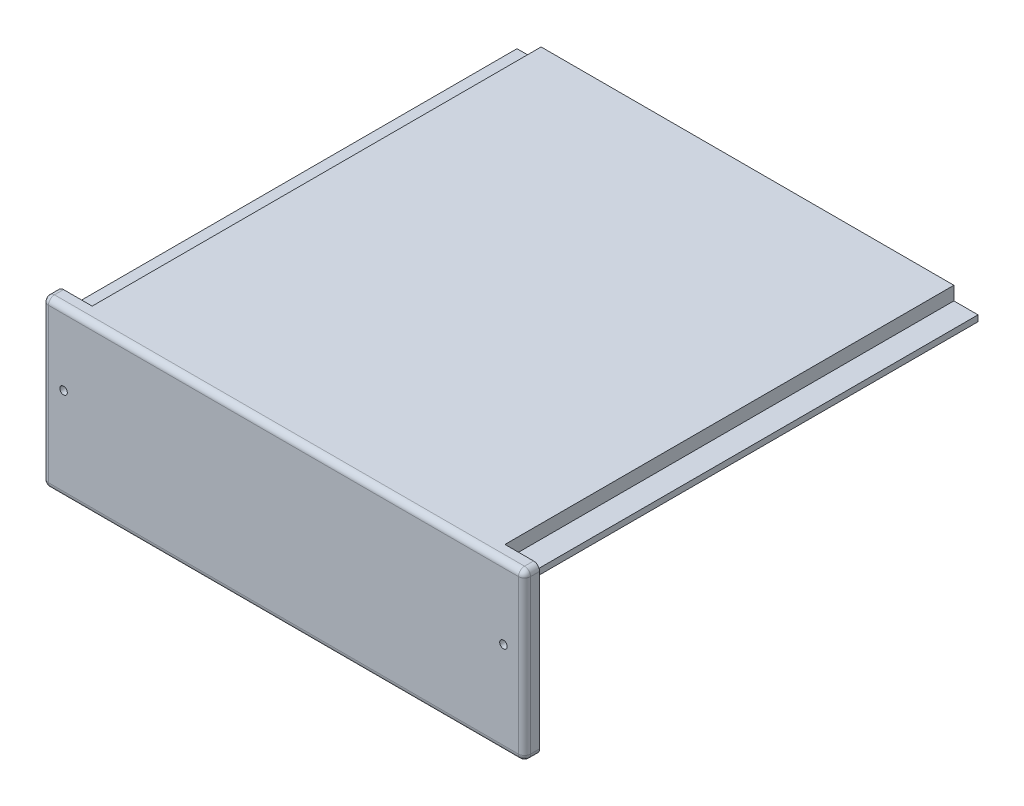
ISO-10303-21;
HEADER;
FILE_DESCRIPTION(('STEP AP214'),'2;1');
FILE_NAME('part.step','',(''),(''),'','','');
FILE_SCHEMA(('AUTOMOTIVE_DESIGN { 1 0 10303 214 1 1 1 1 }'));
ENDSEC;
DATA;
#1=APPLICATION_CONTEXT('core data for automotive mechanical design processes');
#2=APPLICATION_PROTOCOL_DEFINITION('international standard','automotive_design',2000,#1);
#3=PRODUCT_CONTEXT('',#1,'mechanical');
#4=PRODUCT('Part','Part','',(#3));
#5=PRODUCT_RELATED_PRODUCT_CATEGORY('part','',(#4));
#6=PRODUCT_DEFINITION_FORMATION('','',#4);
#7=PRODUCT_DEFINITION_CONTEXT('part definition',#1,'design');
#8=PRODUCT_DEFINITION('design','',#6,#7);
#9=PRODUCT_DEFINITION_SHAPE('','',#8);
#10=(LENGTH_UNIT() NAMED_UNIT(*) SI_UNIT(.MILLI.,.METRE.));
#11=(NAMED_UNIT(*) PLANE_ANGLE_UNIT() SI_UNIT($,.RADIAN.));
#12=(NAMED_UNIT(*) SI_UNIT($,.STERADIAN.) SOLID_ANGLE_UNIT());
#13=UNCERTAINTY_MEASURE_WITH_UNIT(LENGTH_MEASURE(1.E-05),#10,'distance_accuracy_value','');
#14=(GEOMETRIC_REPRESENTATION_CONTEXT(3) GLOBAL_UNCERTAINTY_ASSIGNED_CONTEXT((#13)) GLOBAL_UNIT_ASSIGNED_CONTEXT((#10,
#11,#12)) REPRESENTATION_CONTEXT('',''));
#15=CARTESIAN_POINT('',(0.,0.,0.));
#16=DIRECTION('',(0.,0.,1.));
#17=DIRECTION('',(1.,0.,0.));
#18=AXIS2_PLACEMENT_3D('',#15,#16,#17);
#19=CARTESIAN_POINT('',(0.,0.,0.));
#20=DIRECTION('',(0.,0.,-1.));
#21=DIRECTION('',(-1.,0.,0.));
#22=AXIS2_PLACEMENT_3D('',#19,#20,#21);
#23=PLANE('',#22);
#24=CARTESIAN_POINT('',(-73.,31.,0.));
#25=DIRECTION('',(0.,0.,1.));
#26=DIRECTION('',(1.,0.,0.));
#27=AXIS2_PLACEMENT_3D('',#24,#25,#26);
#28=CIRCLE('',#27,1.25);
#29=CARTESIAN_POINT('',(-71.75,31.,0.));
#30=VERTEX_POINT('',#29);
#31=EDGE_CURVE('E259',#30,#30,#28,.T.);
#32=ORIENTED_EDGE('',*,*,#31,.T.);
#33=EDGE_LOOP('',(#32));
#34=FACE_BOUND('',#33,.T.);
#35=CARTESIAN_POINT('',(73.,31.,0.));
#36=DIRECTION('',(0.,0.,-1.));
#37=DIRECTION('',(-1.,0.,0.));
#38=AXIS2_PLACEMENT_3D('',#35,#36,#37);
#39=CIRCLE('',#38,1.25);
#40=CARTESIAN_POINT('',(71.75,31.,0.));
#41=VERTEX_POINT('',#40);
#42=EDGE_CURVE('E266',#41,#41,#39,.T.);
#43=ORIENTED_EDGE('',*,*,#42,.F.);
#44=EDGE_LOOP('',(#43));
#45=FACE_BOUND('',#44,.T.);
#46=DIRECTION('',(-1.,0.,0.));
#47=VECTOR('',#46,1.);
#48=CARTESIAN_POINT('',(69.,13.,0.));
#49=LINE('',#48,#47);
#50=CARTESIAN_POINT('',(69.,13.,0.));
#51=VERTEX_POINT('',#50);
#52=CARTESIAN_POINT('',(-69.,13.,0.));
#53=VERTEX_POINT('',#52);
#54=EDGE_CURVE('E317',#51,#53,#49,.T.);
#55=ORIENTED_EDGE('',*,*,#54,.F.);
#56=DIRECTION('',(0.,-1.,0.));
#57=VECTOR('',#56,1.);
#58=CARTESIAN_POINT('',(69.,17.,0.));
#59=LINE('',#58,#57);
#60=CARTESIAN_POINT('',(69.,17.,0.));
#61=VERTEX_POINT('',#60);
#62=EDGE_CURVE('E303',#61,#51,#59,.T.);
#63=ORIENTED_EDGE('',*,*,#62,.F.);
#64=DIRECTION('',(1.,0.,0.));
#65=VECTOR('',#64,1.);
#66=CARTESIAN_POINT('',(69.,17.,0.));
#67=LINE('',#66,#65);
#68=CARTESIAN_POINT('',(-69.,17.,0.));
#69=VERTEX_POINT('',#68);
#70=EDGE_CURVE('E308',#69,#61,#67,.T.);
#71=ORIENTED_EDGE('',*,*,#70,.F.);
#72=DIRECTION('',(0.,1.,0.));
#73=VECTOR('',#72,1.);
#74=CARTESIAN_POINT('',(-69.,17.,0.));
#75=LINE('',#74,#73);
#76=EDGE_CURVE('E319',#53,#69,#75,.T.);
#77=ORIENTED_EDGE('',*,*,#76,.F.);
#78=EDGE_LOOP('',(#55,#63,#71,#77));
#79=FACE_BOUND('',#78,.T.);
#80=DIRECTION('',(-1.,0.,0.));
#81=VECTOR('',#80,1.);
#82=CARTESIAN_POINT('',(69.,6.,0.));
#83=LINE('',#82,#81);
#84=CARTESIAN_POINT('',(69.,6.,0.));
#85=VERTEX_POINT('',#84);
#86=CARTESIAN_POINT('',(-69.,6.,0.));
#87=VERTEX_POINT('',#86);
#88=EDGE_CURVE('E288',#85,#87,#83,.T.);
#89=ORIENTED_EDGE('',*,*,#88,.F.);
#90=DIRECTION('',(0.,-1.,0.));
#91=VECTOR('',#90,1.);
#92=CARTESIAN_POINT('',(69.,10.,0.));
#93=LINE('',#92,#91);
#94=CARTESIAN_POINT('',(69.,10.,0.));
#95=VERTEX_POINT('',#94);
#96=EDGE_CURVE('E285',#95,#85,#93,.T.);
#97=ORIENTED_EDGE('',*,*,#96,.F.);
#98=DIRECTION('',(1.,0.,0.));
#99=VECTOR('',#98,1.);
#100=CARTESIAN_POINT('',(69.,10.,0.));
#101=LINE('',#100,#99);
#102=CARTESIAN_POINT('',(-69.,10.,0.));
#103=VERTEX_POINT('',#102);
#104=EDGE_CURVE('E278',#103,#95,#101,.T.);
#105=ORIENTED_EDGE('',*,*,#104,.F.);
#106=DIRECTION('',(0.,1.,0.));
#107=VECTOR('',#106,1.);
#108=CARTESIAN_POINT('',(-69.,10.,0.));
#109=LINE('',#108,#107);
#110=EDGE_CURVE('E290',#87,#103,#109,.T.);
#111=ORIENTED_EDGE('',*,*,#110,.F.);
#112=EDGE_LOOP('',(#89,#97,#105,#111));
#113=FACE_BOUND('',#112,.T.);
#114=DIRECTION('',(1.,0.,0.));
#115=VECTOR('',#114,1.);
#116=CARTESIAN_POINT('',(68.5,50.5,0.));
#117=LINE('',#116,#115);
#118=CARTESIAN_POINT('',(68.5,50.5,0.));
#119=VERTEX_POINT('',#118);
#120=CARTESIAN_POINT('',(76.5,50.5,0.));
#121=VERTEX_POINT('',#120);
#122=EDGE_CURVE('E930',#119,#121,#117,.T.);
#123=ORIENTED_EDGE('',*,*,#122,.F.);
#124=DIRECTION('',(0.,-1.,0.));
#125=VECTOR('',#124,1.);
#126=CARTESIAN_POINT('',(68.5,55.,0.));
#127=LINE('',#126,#125);
#128=CARTESIAN_POINT('',(68.5,55.,0.));
#129=VERTEX_POINT('',#128);
#130=EDGE_CURVE('E936',#129,#119,#127,.T.);
#131=ORIENTED_EDGE('',*,*,#130,.F.);
#132=DIRECTION('',(-1.,0.,0.));
#133=VECTOR('',#132,1.);
#134=CARTESIAN_POINT('',(80.,55.,0.));
#135=LINE('',#134,#133);
#136=CARTESIAN_POINT('',(78.,55.,0.));
#137=VERTEX_POINT('',#136);
#138=EDGE_CURVE('E255',#137,#129,#135,.T.);
#139=ORIENTED_EDGE('',*,*,#138,.F.);
#140=CARTESIAN_POINT('',(78.,53.,0.));
#141=DIRECTION('',(0.,0.,-1.));
#142=DIRECTION('',(-1.,0.,0.));
#143=AXIS2_PLACEMENT_3D('',#140,#141,#142);
#144=CIRCLE('',#143,2.);
#145=CARTESIAN_POINT('',(80.,53.,0.));
#146=VERTEX_POINT('',#145);
#147=EDGE_CURVE('E355',#137,#146,#144,.T.);
#148=ORIENTED_EDGE('',*,*,#147,.T.);
#149=DIRECTION('',(0.,1.,0.));
#150=VECTOR('',#149,1.);
#151=CARTESIAN_POINT('',(80.,55.,0.));
#152=LINE('',#151,#150);
#153=CARTESIAN_POINT('',(80.,2.00000000000002,0.));
#154=VERTEX_POINT('',#153);
#155=EDGE_CURVE('E332',#154,#146,#152,.T.);
#156=ORIENTED_EDGE('',*,*,#155,.F.);
#157=CARTESIAN_POINT('',(78.,2.,0.));
#158=DIRECTION('',(0.,0.,-1.));
#159=DIRECTION('',(-1.,0.,0.));
#160=AXIS2_PLACEMENT_3D('',#157,#158,#159);
#161=CIRCLE('',#160,2.);
#162=CARTESIAN_POINT('',(78.,0.,0.));
#163=VERTEX_POINT('',#162);
#164=EDGE_CURVE('E350',#154,#163,#161,.T.);
#165=ORIENTED_EDGE('',*,*,#164,.T.);
#166=DIRECTION('',(1.,0.,0.));
#167=VECTOR('',#166,1.);
#168=CARTESIAN_POINT('',(80.,0.,0.));
#169=LINE('',#168,#167);
#170=CARTESIAN_POINT('',(-78.,0.,0.));
#171=VERTEX_POINT('',#170);
#172=EDGE_CURVE('E340',#171,#163,#169,.T.);
#173=ORIENTED_EDGE('',*,*,#172,.F.);
#174=CARTESIAN_POINT('',(-78.,1.99999999999998,0.));
#175=DIRECTION('',(0.,0.,-1.));
#176=DIRECTION('',(-1.,0.,0.));
#177=AXIS2_PLACEMENT_3D('',#174,#175,#176);
#178=CIRCLE('',#177,2.);
#179=CARTESIAN_POINT('',(-80.,1.99999999999999,0.));
#180=VERTEX_POINT('',#179);
#181=EDGE_CURVE('E348',#171,#180,#178,.T.);
#182=ORIENTED_EDGE('',*,*,#181,.T.);
#183=DIRECTION('',(0.,-1.,0.));
#184=VECTOR('',#183,1.);
#185=CARTESIAN_POINT('',(-80.,55.,0.));
#186=LINE('',#185,#184);
#187=CARTESIAN_POINT('',(-80.,53.,0.));
#188=VERTEX_POINT('',#187);
#189=EDGE_CURVE('E337',#188,#180,#186,.T.);
#190=ORIENTED_EDGE('',*,*,#189,.F.);
#191=CARTESIAN_POINT('',(-78.,53.,0.));
#192=DIRECTION('',(0.,0.,-1.));
#193=DIRECTION('',(-1.,0.,0.));
#194=AXIS2_PLACEMENT_3D('',#191,#192,#193);
#195=CIRCLE('',#194,2.);
#196=CARTESIAN_POINT('',(-78.,55.,0.));
#197=VERTEX_POINT('',#196);
#198=EDGE_CURVE('E352',#188,#197,#195,.T.);
#199=ORIENTED_EDGE('',*,*,#198,.T.);
#200=CARTESIAN_POINT('',(-68.5,55.,0.));
#201=VERTEX_POINT('',#200);
#202=EDGE_CURVE('E335',#201,#197,#135,.T.);
#203=ORIENTED_EDGE('',*,*,#202,.F.);
#204=DIRECTION('',(0.,1.,0.));
#205=VECTOR('',#204,1.);
#206=CARTESIAN_POINT('',(-68.5,55.,0.));
#207=LINE('',#206,#205);
#208=CARTESIAN_POINT('',(-68.5,50.5,0.));
#209=VERTEX_POINT('',#208);
#210=EDGE_CURVE('E249',#209,#201,#207,.T.);
#211=ORIENTED_EDGE('',*,*,#210,.F.);
#212=DIRECTION('',(1.,0.,0.));
#213=VECTOR('',#212,1.);
#214=CARTESIAN_POINT('',(-68.5,50.5,0.));
#215=LINE('',#214,#213);
#216=CARTESIAN_POINT('',(-76.5,50.5,0.));
#217=VERTEX_POINT('',#216);
#218=EDGE_CURVE('E894',#217,#209,#215,.T.);
#219=ORIENTED_EDGE('',*,*,#218,.F.);
#220=DIRECTION('',(0.,1.,0.));
#221=VECTOR('',#220,1.);
#222=CARTESIAN_POINT('',(-76.5,50.5,0.));
#223=LINE('',#222,#221);
#224=CARTESIAN_POINT('',(-76.5,48.5,0.));
#225=VERTEX_POINT('',#224);
#226=EDGE_CURVE('E896',#225,#217,#223,.T.);
#227=ORIENTED_EDGE('',*,*,#226,.F.);
#228=DIRECTION('',(-1.,0.,0.));
#229=VECTOR('',#228,1.);
#230=CARTESIAN_POINT('',(-76.5,48.5,0.));
#231=LINE('',#230,#229);
#232=CARTESIAN_POINT('',(-68.5,48.5,0.));
#233=VERTEX_POINT('',#232);
#234=EDGE_CURVE('E945',#233,#225,#231,.T.);
#235=ORIENTED_EDGE('',*,*,#234,.F.);
#236=DIRECTION('',(0.,1.,0.));
#237=VECTOR('',#236,1.);
#238=CARTESIAN_POINT('',(-68.5,48.5,0.));
#239=LINE('',#238,#237);
#240=CARTESIAN_POINT('',(-68.5,45.,0.));
#241=VERTEX_POINT('',#240);
#242=EDGE_CURVE('E943',#241,#233,#239,.T.);
#243=ORIENTED_EDGE('',*,*,#242,.F.);
#244=DIRECTION('',(-1.,0.,0.));
#245=VECTOR('',#244,1.);
#246=CARTESIAN_POINT('',(68.5,45.,0.));
#247=LINE('',#246,#245);
#248=CARTESIAN_POINT('',(68.5,45.,0.));
#249=VERTEX_POINT('',#248);
#250=EDGE_CURVE('E941',#249,#241,#247,.T.);
#251=ORIENTED_EDGE('',*,*,#250,.F.);
#252=DIRECTION('',(0.,-1.,0.));
#253=VECTOR('',#252,1.);
#254=CARTESIAN_POINT('',(68.5,48.5,0.));
#255=LINE('',#254,#253);
#256=CARTESIAN_POINT('',(68.5,48.5,0.));
#257=VERTEX_POINT('',#256);
#258=EDGE_CURVE('E934',#257,#249,#255,.T.);
#259=ORIENTED_EDGE('',*,*,#258,.F.);
#260=DIRECTION('',(-1.,0.,0.));
#261=VECTOR('',#260,1.);
#262=CARTESIAN_POINT('',(76.5,48.5,0.));
#263=LINE('',#262,#261);
#264=CARTESIAN_POINT('',(76.5,48.5,0.));
#265=VERTEX_POINT('',#264);
#266=EDGE_CURVE('E932',#265,#257,#263,.T.);
#267=ORIENTED_EDGE('',*,*,#266,.F.);
#268=DIRECTION('',(0.,-1.,0.));
#269=VECTOR('',#268,1.);
#270=CARTESIAN_POINT('',(76.5,50.5,0.));
#271=LINE('',#270,#269);
#272=EDGE_CURVE('E927',#121,#265,#271,.T.);
#273=ORIENTED_EDGE('',*,*,#272,.F.);
#274=EDGE_LOOP('',(#123,#131,#139,#148,#156,#165,#173,#182,#190,#199,#203,#211,#219,#227,#235,
#243,#251,#259,#267,#273));
#275=FACE_BOUND('',#274,.T.);
#276=ADVANCED_FACE('F35',(#34,#45,#79,#113,#275),#23,.T.);
#277=CARTESIAN_POINT('',(80.,55.,5.));
#278=DIRECTION('',(-1.,0.,0.));
#279=DIRECTION('',(0.,0.,1.));
#280=AXIS2_PLACEMENT_3D('',#277,#278,#279);
#281=PLANE('',#280);
#282=ORIENTED_EDGE('',*,*,#155,.T.);
#283=DIRECTION('',(0.,0.,-1.));
#284=VECTOR('',#283,1.);
#285=CARTESIAN_POINT('',(80.,53.,5.));
#286=LINE('',#285,#284);
#287=CARTESIAN_POINT('',(80.,53.,3.));
#288=VERTEX_POINT('',#287);
#289=EDGE_CURVE('E361',#146,#288,#286,.F.);
#290=ORIENTED_EDGE('',*,*,#289,.T.);
#291=DIRECTION('',(0.,1.,0.));
#292=VECTOR('',#291,1.);
#293=CARTESIAN_POINT('',(80.,55.,3.));
#294=LINE('',#293,#292);
#295=CARTESIAN_POINT('',(80.,2.,3.));
#296=VERTEX_POINT('',#295);
#297=EDGE_CURVE('E359',#288,#296,#294,.F.);
#298=ORIENTED_EDGE('',*,*,#297,.T.);
#299=DIRECTION('',(0.,0.,-1.));
#300=VECTOR('',#299,1.);
#301=CARTESIAN_POINT('',(80.,2.,5.));
#302=LINE('',#301,#300);
#303=EDGE_CURVE('E357',#296,#154,#302,.T.);
#304=ORIENTED_EDGE('',*,*,#303,.T.);
#305=EDGE_LOOP('',(#282,#290,#298,#304));
#306=FACE_BOUND('',#305,.T.);
#307=ADVANCED_FACE('F472',(#306),#281,.F.);
#308=CARTESIAN_POINT('',(80.,55.,5.));
#309=DIRECTION('',(0.,-1.,0.));
#310=DIRECTION('',(1.,0.,0.));
#311=AXIS2_PLACEMENT_3D('',#308,#309,#310);
#312=PLANE('',#311);
#313=DIRECTION('',(-1.,0.,0.));
#314=VECTOR('',#313,1.);
#315=CARTESIAN_POINT('',(80.,55.,3.));
#316=LINE('',#315,#314);
#317=CARTESIAN_POINT('',(-78.,55.,3.));
#318=VERTEX_POINT('',#317);
#319=CARTESIAN_POINT('',(78.,55.,3.));
#320=VERTEX_POINT('',#319);
#321=EDGE_CURVE('E342',#318,#320,#316,.F.);
#322=ORIENTED_EDGE('',*,*,#321,.T.);
#323=DIRECTION('',(0.,0.,-1.));
#324=VECTOR('',#323,1.);
#325=CARTESIAN_POINT('',(78.,55.,5.));
#326=LINE('',#325,#324);
#327=EDGE_CURVE('E346',#320,#137,#326,.T.);
#328=ORIENTED_EDGE('',*,*,#327,.T.);
#329=ORIENTED_EDGE('',*,*,#138,.T.);
#330=DIRECTION('',(0.,0.,1.));
#331=VECTOR('',#330,1.);
#332=CARTESIAN_POINT('',(68.5,55.,-149.));
#333=LINE('',#332,#331);
#334=CARTESIAN_POINT('',(68.5,55.,-149.));
#335=VERTEX_POINT('',#334);
#336=EDGE_CURVE('E237',#335,#129,#333,.T.);
#337=ORIENTED_EDGE('',*,*,#336,.F.);
#338=DIRECTION('',(1.,0.,0.));
#339=VECTOR('',#338,1.);
#340=CARTESIAN_POINT('',(-68.5,55.,-149.));
#341=LINE('',#340,#339);
#342=CARTESIAN_POINT('',(-68.5,55.,-149.));
#343=VERTEX_POINT('',#342);
#344=EDGE_CURVE('E244',#343,#335,#341,.T.);
#345=ORIENTED_EDGE('',*,*,#344,.F.);
#346=DIRECTION('',(0.,0.,1.));
#347=VECTOR('',#346,1.);
#348=CARTESIAN_POINT('',(-68.5,55.,-149.));
#349=LINE('',#348,#347);
#350=EDGE_CURVE('E52',#343,#201,#349,.T.);
#351=ORIENTED_EDGE('',*,*,#350,.T.);
#352=ORIENTED_EDGE('',*,*,#202,.T.);
#353=DIRECTION('',(0.,0.,-1.));
#354=VECTOR('',#353,1.);
#355=CARTESIAN_POINT('',(-78.,55.,5.));
#356=LINE('',#355,#354);
#357=EDGE_CURVE('E344',#197,#318,#356,.F.);
#358=ORIENTED_EDGE('',*,*,#357,.T.);
#359=EDGE_LOOP('',(#322,#328,#329,#337,#345,#351,#352,#358));
#360=FACE_BOUND('',#359,.T.);
#361=ADVANCED_FACE('F252',(#360),#312,.F.);
#362=CARTESIAN_POINT('',(-80.,55.,5.));
#363=DIRECTION('',(1.,0.,0.));
#364=DIRECTION('',(0.,0.,-1.));
#365=AXIS2_PLACEMENT_3D('',#362,#363,#364);
#366=PLANE('',#365);
#367=DIRECTION('',(0.,-1.,0.));
#368=VECTOR('',#367,1.);
#369=CARTESIAN_POINT('',(-80.,55.,3.));
#370=LINE('',#369,#368);
#371=CARTESIAN_POINT('',(-80.,1.99999999999998,3.));
#372=VERTEX_POINT('',#371);
#373=CARTESIAN_POINT('',(-80.,53.,3.));
#374=VERTEX_POINT('',#373);
#375=EDGE_CURVE('E365',#372,#374,#370,.F.);
#376=ORIENTED_EDGE('',*,*,#375,.T.);
#377=DIRECTION('',(0.,0.,-1.));
#378=VECTOR('',#377,1.);
#379=CARTESIAN_POINT('',(-80.,53.,5.));
#380=LINE('',#379,#378);
#381=EDGE_CURVE('E367',#374,#188,#380,.T.);
#382=ORIENTED_EDGE('',*,*,#381,.T.);
#383=ORIENTED_EDGE('',*,*,#189,.T.);
#384=DIRECTION('',(0.,0.,-1.));
#385=VECTOR('',#384,1.);
#386=CARTESIAN_POINT('',(-80.,1.99999999999998,5.));
#387=LINE('',#386,#385);
#388=EDGE_CURVE('E363',#180,#372,#387,.F.);
#389=ORIENTED_EDGE('',*,*,#388,.T.);
#390=EDGE_LOOP('',(#376,#382,#383,#389));
#391=FACE_BOUND('',#390,.T.);
#392=ADVANCED_FACE('F449',(#391),#366,.F.);
#393=CARTESIAN_POINT('',(80.,0.,5.));
#394=DIRECTION('',(0.,1.,0.));
#395=DIRECTION('',(-1.,0.,0.));
#396=AXIS2_PLACEMENT_3D('',#393,#394,#395);
#397=PLANE('',#396);
#398=ORIENTED_EDGE('',*,*,#172,.T.);
#399=DIRECTION('',(0.,0.,-1.));
#400=VECTOR('',#399,1.);
#401=CARTESIAN_POINT('',(78.,0.,5.));
#402=LINE('',#401,#400);
#403=CARTESIAN_POINT('',(78.,0.,3.));
#404=VERTEX_POINT('',#403);
#405=EDGE_CURVE('E11',#163,#404,#402,.F.);
#406=ORIENTED_EDGE('',*,*,#405,.T.);
#407=DIRECTION('',(1.,0.,0.));
#408=VECTOR('',#407,1.);
#409=CARTESIAN_POINT('',(80.,0.,3.));
#410=LINE('',#409,#408);
#411=CARTESIAN_POINT('',(-78.,0.,3.));
#412=VERTEX_POINT('',#411);
#413=EDGE_CURVE('E44',#404,#412,#410,.F.);
#414=ORIENTED_EDGE('',*,*,#413,.T.);
#415=DIRECTION('',(0.,0.,-1.));
#416=VECTOR('',#415,1.);
#417=CARTESIAN_POINT('',(-78.,0.,5.));
#418=LINE('',#417,#416);
#419=EDGE_CURVE('E378',#412,#171,#418,.T.);
#420=ORIENTED_EDGE('',*,*,#419,.T.);
#421=EDGE_LOOP('',(#398,#406,#414,#420));
#422=FACE_BOUND('',#421,.T.);
#423=ADVANCED_FACE('F424',(#422),#397,.F.);
#424=CARTESIAN_POINT('',(0.,0.,5.));
#425=DIRECTION('',(0.,0.,-1.));
#426=DIRECTION('',(-1.,0.,0.));
#427=AXIS2_PLACEMENT_3D('',#424,#425,#426);
#428=PLANE('',#427);
#429=CARTESIAN_POINT('',(-73.,31.,5.));
#430=DIRECTION('',(0.,0.,-1.));
#431=DIRECTION('',(-1.,0.,0.));
#432=AXIS2_PLACEMENT_3D('',#429,#430,#431);
#433=CIRCLE('',#432,1.25);
#434=CARTESIAN_POINT('',(-74.25,31.,5.));
#435=VERTEX_POINT('',#434);
#436=EDGE_CURVE('E256',#435,#435,#433,.T.);
#437=ORIENTED_EDGE('',*,*,#436,.T.);
#438=EDGE_LOOP('',(#437));
#439=FACE_BOUND('',#438,.T.);
#440=CARTESIAN_POINT('',(73.,31.,5.));
#441=DIRECTION('',(0.,0.,-1.));
#442=DIRECTION('',(-1.,0.,0.));
#443=AXIS2_PLACEMENT_3D('',#440,#441,#442);
#444=CIRCLE('',#443,1.25);
#445=CARTESIAN_POINT('',(71.75,31.,5.));
#446=VERTEX_POINT('',#445);
#447=EDGE_CURVE('E270',#446,#446,#444,.F.);
#448=ORIENTED_EDGE('',*,*,#447,.F.);
#449=EDGE_LOOP('',(#448));
#450=FACE_BOUND('',#449,.T.);
#451=DIRECTION('',(0.,1.,0.));
#452=VECTOR('',#451,1.);
#453=CARTESIAN_POINT('',(78.,0.,5.));
#454=LINE('',#453,#452);
#455=CARTESIAN_POINT('',(78.,2.,5.));
#456=VERTEX_POINT('',#455);
#457=CARTESIAN_POINT('',(78.,53.,5.));
#458=VERTEX_POINT('',#457);
#459=EDGE_CURVE('E373',#456,#458,#454,.T.);
#460=ORIENTED_EDGE('',*,*,#459,.T.);
#461=DIRECTION('',(-1.,0.,0.));
#462=VECTOR('',#461,1.);
#463=CARTESIAN_POINT('',(0.,53.,5.));
#464=LINE('',#463,#462);
#465=CARTESIAN_POINT('',(-78.,53.,5.));
#466=VERTEX_POINT('',#465);
#467=EDGE_CURVE('E375',#458,#466,#464,.T.);
#468=ORIENTED_EDGE('',*,*,#467,.T.);
#469=DIRECTION('',(0.,-1.,0.));
#470=VECTOR('',#469,1.);
#471=CARTESIAN_POINT('',(-78.,0.,5.));
#472=LINE('',#471,#470);
#473=CARTESIAN_POINT('',(-78.,1.99999999999998,5.));
#474=VERTEX_POINT('',#473);
#475=EDGE_CURVE('E371',#466,#474,#472,.T.);
#476=ORIENTED_EDGE('',*,*,#475,.T.);
#477=DIRECTION('',(1.,0.,0.));
#478=VECTOR('',#477,1.);
#479=CARTESIAN_POINT('',(0.,1.99999999999999,5.));
#480=LINE('',#479,#478);
#481=EDGE_CURVE('E369',#474,#456,#480,.T.);
#482=ORIENTED_EDGE('',*,*,#481,.T.);
#483=EDGE_LOOP('',(#460,#468,#476,#482));
#484=FACE_BOUND('',#483,.T.);
#485=ADVANCED_FACE('F441',(#439,#450,#484),#428,.F.);
#486=CARTESIAN_POINT('',(69.,17.,-4.));
#487=DIRECTION('',(-1.,0.,0.));
#488=DIRECTION('',(0.,0.,1.));
#489=AXIS2_PLACEMENT_3D('',#486,#487,#488);
#490=PLANE('',#489);
#491=ORIENTED_EDGE('',*,*,#62,.T.);
#492=DIRECTION('',(0.,0.,1.));
#493=VECTOR('',#492,1.);
#494=CARTESIAN_POINT('',(69.,13.,-4.));
#495=LINE('',#494,#493);
#496=CARTESIAN_POINT('',(69.,13.,-4.));
#497=VERTEX_POINT('',#496);
#498=EDGE_CURVE('E330',#497,#51,#495,.T.);
#499=ORIENTED_EDGE('',*,*,#498,.F.);
#500=DIRECTION('',(0.,-1.,0.));
#501=VECTOR('',#500,1.);
#502=CARTESIAN_POINT('',(69.,17.,-4.));
#503=LINE('',#502,#501);
#504=CARTESIAN_POINT('',(69.,17.,-4.));
#505=VERTEX_POINT('',#504);
#506=EDGE_CURVE('E304',#505,#497,#503,.T.);
#507=ORIENTED_EDGE('',*,*,#506,.F.);
#508=DIRECTION('',(0.,0.,1.));
#509=VECTOR('',#508,1.);
#510=CARTESIAN_POINT('',(69.,17.,-4.));
#511=LINE('',#510,#509);
#512=EDGE_CURVE('E314',#505,#61,#511,.T.);
#513=ORIENTED_EDGE('',*,*,#512,.T.);
#514=EDGE_LOOP('',(#491,#499,#507,#513));
#515=FACE_BOUND('',#514,.T.);
#516=ADVANCED_FACE('F812',(#515),#490,.F.);
#517=CARTESIAN_POINT('',(69.,13.,-4.));
#518=DIRECTION('',(0.,1.,0.));
#519=DIRECTION('',(0.,0.,1.));
#520=AXIS2_PLACEMENT_3D('',#517,#518,#519);
#521=PLANE('',#520);
#522=ORIENTED_EDGE('',*,*,#54,.T.);
#523=DIRECTION('',(0.,0.,1.));
#524=VECTOR('',#523,1.);
#525=CARTESIAN_POINT('',(-69.,13.,-4.));
#526=LINE('',#525,#524);
#527=CARTESIAN_POINT('',(-69.,13.,-4.));
#528=VERTEX_POINT('',#527);
#529=EDGE_CURVE('E327',#528,#53,#526,.T.);
#530=ORIENTED_EDGE('',*,*,#529,.F.);
#531=DIRECTION('',(-1.,0.,0.));
#532=VECTOR('',#531,1.);
#533=CARTESIAN_POINT('',(69.,13.,-4.));
#534=LINE('',#533,#532);
#535=EDGE_CURVE('E307',#497,#528,#534,.T.);
#536=ORIENTED_EDGE('',*,*,#535,.F.);
#537=ORIENTED_EDGE('',*,*,#498,.T.);
#538=EDGE_LOOP('',(#522,#530,#536,#537));
#539=FACE_BOUND('',#538,.T.);
#540=ADVANCED_FACE('F803',(#539),#521,.F.);
#541=CARTESIAN_POINT('',(-69.,17.,-4.));
#542=DIRECTION('',(1.,0.,0.));
#543=DIRECTION('',(0.,0.,-1.));
#544=AXIS2_PLACEMENT_3D('',#541,#542,#543);
#545=PLANE('',#544);
#546=ORIENTED_EDGE('',*,*,#76,.T.);
#547=DIRECTION('',(0.,0.,1.));
#548=VECTOR('',#547,1.);
#549=CARTESIAN_POINT('',(-69.,17.,-4.));
#550=LINE('',#549,#548);
#551=CARTESIAN_POINT('',(-69.,17.,-4.));
#552=VERTEX_POINT('',#551);
#553=EDGE_CURVE('E325',#552,#69,#550,.T.);
#554=ORIENTED_EDGE('',*,*,#553,.F.);
#555=DIRECTION('',(0.,1.,0.));
#556=VECTOR('',#555,1.);
#557=CARTESIAN_POINT('',(-69.,17.,-4.));
#558=LINE('',#557,#556);
#559=EDGE_CURVE('E310',#528,#552,#558,.T.);
#560=ORIENTED_EDGE('',*,*,#559,.F.);
#561=ORIENTED_EDGE('',*,*,#529,.T.);
#562=EDGE_LOOP('',(#546,#554,#560,#561));
#563=FACE_BOUND('',#562,.T.);
#564=ADVANCED_FACE('F794',(#563),#545,.F.);
#565=CARTESIAN_POINT('',(69.,17.,-4.));
#566=DIRECTION('',(0.,-1.,0.));
#567=DIRECTION('',(0.,0.,-1.));
#568=AXIS2_PLACEMENT_3D('',#565,#566,#567);
#569=PLANE('',#568);
#570=ORIENTED_EDGE('',*,*,#70,.T.);
#571=ORIENTED_EDGE('',*,*,#512,.F.);
#572=DIRECTION('',(1.,0.,0.));
#573=VECTOR('',#572,1.);
#574=CARTESIAN_POINT('',(69.,17.,-4.));
#575=LINE('',#574,#573);
#576=EDGE_CURVE('E312',#552,#505,#575,.T.);
#577=ORIENTED_EDGE('',*,*,#576,.F.);
#578=ORIENTED_EDGE('',*,*,#553,.T.);
#579=EDGE_LOOP('',(#570,#571,#577,#578));
#580=FACE_BOUND('',#579,.T.);
#581=ADVANCED_FACE('F785',(#580),#569,.F.);
#582=CARTESIAN_POINT('',(0.,0.,-4.));
#583=DIRECTION('',(0.,0.,-1.));
#584=DIRECTION('',(-1.,0.,0.));
#585=AXIS2_PLACEMENT_3D('',#582,#583,#584);
#586=PLANE('',#585);
#587=ORIENTED_EDGE('',*,*,#506,.T.);
#588=ORIENTED_EDGE('',*,*,#535,.T.);
#589=ORIENTED_EDGE('',*,*,#559,.T.);
#590=ORIENTED_EDGE('',*,*,#576,.T.);
#591=EDGE_LOOP('',(#587,#588,#589,#590));
#592=FACE_BOUND('',#591,.T.);
#593=ADVANCED_FACE('F776',(#592),#586,.T.);
#594=CARTESIAN_POINT('',(69.,10.,-4.));
#595=DIRECTION('',(-1.,0.,0.));
#596=DIRECTION('',(0.,-1.,0.));
#597=AXIS2_PLACEMENT_3D('',#594,#595,#596);
#598=PLANE('',#597);
#599=ORIENTED_EDGE('',*,*,#96,.T.);
#600=DIRECTION('',(0.,0.,1.));
#601=VECTOR('',#600,1.);
#602=CARTESIAN_POINT('',(69.,6.,-4.));
#603=LINE('',#602,#601);
#604=CARTESIAN_POINT('',(69.,6.,-4.));
#605=VERTEX_POINT('',#604);
#606=EDGE_CURVE('E301',#605,#85,#603,.T.);
#607=ORIENTED_EDGE('',*,*,#606,.F.);
#608=DIRECTION('',(0.,-1.,0.));
#609=VECTOR('',#608,1.);
#610=CARTESIAN_POINT('',(69.,10.,-4.));
#611=LINE('',#610,#609);
#612=CARTESIAN_POINT('',(69.,10.,-4.));
#613=VERTEX_POINT('',#612);
#614=EDGE_CURVE('E274',#613,#605,#611,.T.);
#615=ORIENTED_EDGE('',*,*,#614,.F.);
#616=DIRECTION('',(0.,0.,1.));
#617=VECTOR('',#616,1.);
#618=CARTESIAN_POINT('',(69.,10.,-4.));
#619=LINE('',#618,#617);
#620=EDGE_CURVE('E284',#613,#95,#619,.T.);
#621=ORIENTED_EDGE('',*,*,#620,.T.);
#622=EDGE_LOOP('',(#599,#607,#615,#621));
#623=FACE_BOUND('',#622,.T.);
#624=ADVANCED_FACE('F767',(#623),#598,.F.);
#625=CARTESIAN_POINT('',(69.,6.,-4.));
#626=DIRECTION('',(0.,1.,0.));
#627=DIRECTION('',(0.,0.,1.));
#628=AXIS2_PLACEMENT_3D('',#625,#626,#627);
#629=PLANE('',#628);
#630=ORIENTED_EDGE('',*,*,#88,.T.);
#631=DIRECTION('',(0.,0.,1.));
#632=VECTOR('',#631,1.);
#633=CARTESIAN_POINT('',(-69.,6.,-4.));
#634=LINE('',#633,#632);
#635=CARTESIAN_POINT('',(-69.,6.,-4.));
#636=VERTEX_POINT('',#635);
#637=EDGE_CURVE('E298',#636,#87,#634,.T.);
#638=ORIENTED_EDGE('',*,*,#637,.F.);
#639=DIRECTION('',(-1.,0.,0.));
#640=VECTOR('',#639,1.);
#641=CARTESIAN_POINT('',(69.,6.,-4.));
#642=LINE('',#641,#640);
#643=EDGE_CURVE('E277',#605,#636,#642,.T.);
#644=ORIENTED_EDGE('',*,*,#643,.F.);
#645=ORIENTED_EDGE('',*,*,#606,.T.);
#646=EDGE_LOOP('',(#630,#638,#644,#645));
#647=FACE_BOUND('',#646,.T.);
#648=ADVANCED_FACE('F758',(#647),#629,.F.);
#649=CARTESIAN_POINT('',(-69.,10.,-4.));
#650=DIRECTION('',(1.,0.,0.));
#651=DIRECTION('',(0.,0.,-1.));
#652=AXIS2_PLACEMENT_3D('',#649,#650,#651);
#653=PLANE('',#652);
#654=ORIENTED_EDGE('',*,*,#110,.T.);
#655=DIRECTION('',(0.,0.,1.));
#656=VECTOR('',#655,1.);
#657=CARTESIAN_POINT('',(-69.,10.,-4.));
#658=LINE('',#657,#656);
#659=CARTESIAN_POINT('',(-69.,10.,-4.));
#660=VERTEX_POINT('',#659);
#661=EDGE_CURVE('E296',#660,#103,#658,.T.);
#662=ORIENTED_EDGE('',*,*,#661,.F.);
#663=DIRECTION('',(0.,1.,0.));
#664=VECTOR('',#663,1.);
#665=CARTESIAN_POINT('',(-69.,10.,-4.));
#666=LINE('',#665,#664);
#667=EDGE_CURVE('E280',#636,#660,#666,.T.);
#668=ORIENTED_EDGE('',*,*,#667,.F.);
#669=ORIENTED_EDGE('',*,*,#637,.T.);
#670=EDGE_LOOP('',(#654,#662,#668,#669));
#671=FACE_BOUND('',#670,.T.);
#672=ADVANCED_FACE('F749',(#671),#653,.F.);
#673=CARTESIAN_POINT('',(69.,10.,-4.));
#674=DIRECTION('',(0.,-1.,0.));
#675=DIRECTION('',(0.,0.,-1.));
#676=AXIS2_PLACEMENT_3D('',#673,#674,#675);
#677=PLANE('',#676);
#678=ORIENTED_EDGE('',*,*,#104,.T.);
#679=ORIENTED_EDGE('',*,*,#620,.F.);
#680=DIRECTION('',(1.,0.,0.));
#681=VECTOR('',#680,1.);
#682=CARTESIAN_POINT('',(69.,10.,-4.));
#683=LINE('',#682,#681);
#684=EDGE_CURVE('E282',#660,#613,#683,.T.);
#685=ORIENTED_EDGE('',*,*,#684,.F.);
#686=ORIENTED_EDGE('',*,*,#661,.T.);
#687=EDGE_LOOP('',(#678,#679,#685,#686));
#688=FACE_BOUND('',#687,.T.);
#689=ADVANCED_FACE('F739',(#688),#677,.F.);
#690=CARTESIAN_POINT('',(0.,0.,-4.));
#691=DIRECTION('',(0.,0.,-1.));
#692=DIRECTION('',(-1.,0.,0.));
#693=AXIS2_PLACEMENT_3D('',#690,#691,#692);
#694=PLANE('',#693);
#695=ORIENTED_EDGE('',*,*,#614,.T.);
#696=ORIENTED_EDGE('',*,*,#643,.T.);
#697=ORIENTED_EDGE('',*,*,#667,.T.);
#698=ORIENTED_EDGE('',*,*,#684,.T.);
#699=EDGE_LOOP('',(#695,#696,#697,#698));
#700=FACE_BOUND('',#699,.T.);
#701=ADVANCED_FACE('F731',(#700),#694,.T.);
#702=CARTESIAN_POINT('',(-78.,1.99999999999998,5.));
#703=DIRECTION('',(0.,0.,-1.));
#704=DIRECTION('',(-1.,0.,0.));
#705=AXIS2_PLACEMENT_3D('',#702,#703,#704);
#706=CYLINDRICAL_SURFACE('',#705,2.);
#707=CARTESIAN_POINT('',(-78.,1.99999999999998,3.));
#708=DIRECTION('',(0.,0.,1.));
#709=DIRECTION('',(1.,0.,0.));
#710=AXIS2_PLACEMENT_3D('',#707,#708,#709);
#711=CIRCLE('',#710,2.);
#712=EDGE_CURVE('E39',#372,#412,#711,.T.);
#713=ORIENTED_EDGE('',*,*,#712,.F.);
#714=ORIENTED_EDGE('',*,*,#388,.F.);
#715=ORIENTED_EDGE('',*,*,#181,.F.);
#716=ORIENTED_EDGE('',*,*,#419,.F.);
#717=EDGE_LOOP('',(#713,#714,#715,#716));
#718=FACE_BOUND('',#717,.T.);
#719=ADVANCED_FACE('F37',(#718),#706,.T.);
#720=CARTESIAN_POINT('',(-78.,1.99999999999998,3.));
#721=DIRECTION('',(0.,0.,1.));
#722=DIRECTION('',(1.,0.,0.));
#723=AXIS2_PLACEMENT_3D('',#720,#721,#722);
#724=SPHERICAL_SURFACE('',#723,2.);
#725=CARTESIAN_POINT('',(-78.,1.99999999999998,3.));
#726=DIRECTION('',(0.,-1.,0.));
#727=DIRECTION('',(0.,0.,-1.));
#728=AXIS2_PLACEMENT_3D('',#725,#726,#727);
#729=CIRCLE('',#728,2.);
#730=EDGE_CURVE('E406',#372,#474,#729,.F.);
#731=ORIENTED_EDGE('',*,*,#730,.F.);
#732=ORIENTED_EDGE('',*,*,#712,.T.);
#733=CARTESIAN_POINT('',(-78.,1.99999999999998,3.));
#734=DIRECTION('',(-1.,0.,0.));
#735=DIRECTION('',(0.,0.,1.));
#736=AXIS2_PLACEMENT_3D('',#733,#734,#735);
#737=CIRCLE('',#736,2.);
#738=EDGE_CURVE('E408',#474,#412,#737,.F.);
#739=ORIENTED_EDGE('',*,*,#738,.F.);
#740=EDGE_LOOP('',(#731,#732,#739));
#741=FACE_BOUND('',#740,.T.);
#742=ADVANCED_FACE('F417',(#741),#724,.T.);
#743=CARTESIAN_POINT('',(78.,2.,5.));
#744=DIRECTION('',(0.,0.,-1.));
#745=DIRECTION('',(-1.,0.,0.));
#746=AXIS2_PLACEMENT_3D('',#743,#744,#745);
#747=CYLINDRICAL_SURFACE('',#746,2.);
#748=ORIENTED_EDGE('',*,*,#164,.F.);
#749=ORIENTED_EDGE('',*,*,#303,.F.);
#750=CARTESIAN_POINT('',(78.,2.,3.));
#751=DIRECTION('',(0.,0.,1.));
#752=DIRECTION('',(1.,0.,0.));
#753=AXIS2_PLACEMENT_3D('',#750,#751,#752);
#754=CIRCLE('',#753,2.);
#755=EDGE_CURVE('E403',#404,#296,#754,.T.);
#756=ORIENTED_EDGE('',*,*,#755,.F.);
#757=ORIENTED_EDGE('',*,*,#405,.F.);
#758=EDGE_LOOP('',(#748,#749,#756,#757));
#759=FACE_BOUND('',#758,.T.);
#760=ADVANCED_FACE('F432',(#759),#747,.T.);
#761=CARTESIAN_POINT('',(0.,1.99999999999999,3.));
#762=DIRECTION('',(1.,0.,0.));
#763=DIRECTION('',(0.,1.,0.));
#764=AXIS2_PLACEMENT_3D('',#761,#762,#763);
#765=CYLINDRICAL_SURFACE('',#764,2.);
#766=ORIENTED_EDGE('',*,*,#738,.T.);
#767=ORIENTED_EDGE('',*,*,#413,.F.);
#768=CARTESIAN_POINT('',(78.,2.,3.));
#769=DIRECTION('',(1.,0.,0.));
#770=DIRECTION('',(0.,0.,-1.));
#771=AXIS2_PLACEMENT_3D('',#768,#769,#770);
#772=CIRCLE('',#771,2.);
#773=EDGE_CURVE('E400',#456,#404,#772,.T.);
#774=ORIENTED_EDGE('',*,*,#773,.F.);
#775=ORIENTED_EDGE('',*,*,#481,.F.);
#776=EDGE_LOOP('',(#766,#767,#774,#775));
#777=FACE_BOUND('',#776,.T.);
#778=ADVANCED_FACE('F439',(#777),#765,.T.);
#779=CARTESIAN_POINT('',(-78.,0.,3.));
#780=DIRECTION('',(0.,-1.,0.));
#781=DIRECTION('',(0.,0.,-1.));
#782=AXIS2_PLACEMENT_3D('',#779,#780,#781);
#783=CYLINDRICAL_SURFACE('',#782,2.);
#784=ORIENTED_EDGE('',*,*,#730,.T.);
#785=ORIENTED_EDGE('',*,*,#475,.F.);
#786=CARTESIAN_POINT('',(-78.,53.,3.));
#787=DIRECTION('',(0.,1.,0.));
#788=DIRECTION('',(0.,0.,1.));
#789=AXIS2_PLACEMENT_3D('',#786,#787,#788);
#790=CIRCLE('',#789,2.);
#791=EDGE_CURVE('E397',#374,#466,#790,.T.);
#792=ORIENTED_EDGE('',*,*,#791,.F.);
#793=ORIENTED_EDGE('',*,*,#375,.F.);
#794=EDGE_LOOP('',(#784,#785,#792,#793));
#795=FACE_BOUND('',#794,.T.);
#796=ADVANCED_FACE('F446',(#795),#783,.T.);
#797=CARTESIAN_POINT('',(-78.,53.,5.));
#798=DIRECTION('',(0.,0.,-1.));
#799=DIRECTION('',(-1.,0.,0.));
#800=AXIS2_PLACEMENT_3D('',#797,#798,#799);
#801=CYLINDRICAL_SURFACE('',#800,2.);
#802=ORIENTED_EDGE('',*,*,#198,.F.);
#803=ORIENTED_EDGE('',*,*,#381,.F.);
#804=CARTESIAN_POINT('',(-78.,53.,3.));
#805=DIRECTION('',(0.,0.,1.));
#806=DIRECTION('',(1.,0.,0.));
#807=AXIS2_PLACEMENT_3D('',#804,#805,#806);
#808=CIRCLE('',#807,2.);
#809=EDGE_CURVE('E394',#318,#374,#808,.T.);
#810=ORIENTED_EDGE('',*,*,#809,.F.);
#811=ORIENTED_EDGE('',*,*,#357,.F.);
#812=EDGE_LOOP('',(#802,#803,#810,#811));
#813=FACE_BOUND('',#812,.T.);
#814=ADVANCED_FACE('F453',(#813),#801,.T.);
#815=CARTESIAN_POINT('',(78.,2.,3.));
#816=DIRECTION('',(0.,0.,1.));
#817=DIRECTION('',(1.,0.,0.));
#818=AXIS2_PLACEMENT_3D('',#815,#816,#817);
#819=SPHERICAL_SURFACE('',#818,2.);
#820=ORIENTED_EDGE('',*,*,#773,.T.);
#821=ORIENTED_EDGE('',*,*,#755,.T.);
#822=CARTESIAN_POINT('',(78.,2.,3.));
#823=DIRECTION('',(0.,-1.,0.));
#824=DIRECTION('',(0.,0.,-1.));
#825=AXIS2_PLACEMENT_3D('',#822,#823,#824);
#826=CIRCLE('',#825,2.);
#827=EDGE_CURVE('E391',#456,#296,#826,.F.);
#828=ORIENTED_EDGE('',*,*,#827,.F.);
#829=EDGE_LOOP('',(#820,#821,#828));
#830=FACE_BOUND('',#829,.T.);
#831=ADVANCED_FACE('F437',(#830),#819,.T.);
#832=CARTESIAN_POINT('',(-78.,53.,3.));
#833=DIRECTION('',(0.,0.,1.));
#834=DIRECTION('',(1.,0.,0.));
#835=AXIS2_PLACEMENT_3D('',#832,#833,#834);
#836=SPHERICAL_SURFACE('',#835,2.);
#837=ORIENTED_EDGE('',*,*,#809,.T.);
#838=ORIENTED_EDGE('',*,*,#791,.T.);
#839=CARTESIAN_POINT('',(-78.,53.,3.));
#840=DIRECTION('',(-1.,0.,0.));
#841=DIRECTION('',(0.,0.,1.));
#842=AXIS2_PLACEMENT_3D('',#839,#840,#841);
#843=CIRCLE('',#842,2.);
#844=EDGE_CURVE('E389',#318,#466,#843,.F.);
#845=ORIENTED_EDGE('',*,*,#844,.F.);
#846=EDGE_LOOP('',(#837,#838,#845));
#847=FACE_BOUND('',#846,.T.);
#848=ADVANCED_FACE('F477',(#847),#836,.T.);
#849=CARTESIAN_POINT('',(78.,0.,3.));
#850=DIRECTION('',(0.,1.,0.));
#851=DIRECTION('',(0.,0.,1.));
#852=AXIS2_PLACEMENT_3D('',#849,#850,#851);
#853=CYLINDRICAL_SURFACE('',#852,2.);
#854=ORIENTED_EDGE('',*,*,#827,.T.);
#855=ORIENTED_EDGE('',*,*,#297,.F.);
#856=CARTESIAN_POINT('',(78.,53.,3.));
#857=DIRECTION('',(0.,1.,0.));
#858=DIRECTION('',(-1.,0.,0.));
#859=AXIS2_PLACEMENT_3D('',#856,#857,#858);
#860=CIRCLE('',#859,2.);
#861=EDGE_CURVE('E386',#458,#288,#860,.T.);
#862=ORIENTED_EDGE('',*,*,#861,.F.);
#863=ORIENTED_EDGE('',*,*,#459,.F.);
#864=EDGE_LOOP('',(#854,#855,#862,#863));
#865=FACE_BOUND('',#864,.T.);
#866=ADVANCED_FACE('F475',(#865),#853,.T.);
#867=CARTESIAN_POINT('',(0.,53.,3.));
#868=DIRECTION('',(-1.,0.,0.));
#869=DIRECTION('',(0.,-1.,0.));
#870=AXIS2_PLACEMENT_3D('',#867,#868,#869);
#871=CYLINDRICAL_SURFACE('',#870,2.);
#872=ORIENTED_EDGE('',*,*,#844,.T.);
#873=ORIENTED_EDGE('',*,*,#467,.F.);
#874=CARTESIAN_POINT('',(78.,53.,3.));
#875=DIRECTION('',(1.,0.,0.));
#876=DIRECTION('',(0.,0.,-1.));
#877=AXIS2_PLACEMENT_3D('',#874,#875,#876);
#878=CIRCLE('',#877,2.);
#879=EDGE_CURVE('E383',#320,#458,#878,.T.);
#880=ORIENTED_EDGE('',*,*,#879,.F.);
#881=ORIENTED_EDGE('',*,*,#321,.F.);
#882=EDGE_LOOP('',(#872,#873,#880,#881));
#883=FACE_BOUND('',#882,.T.);
#884=ADVANCED_FACE('F464',(#883),#871,.T.);
#885=CARTESIAN_POINT('',(78.,53.,3.));
#886=DIRECTION('',(0.,0.,1.));
#887=DIRECTION('',(1.,0.,0.));
#888=AXIS2_PLACEMENT_3D('',#885,#886,#887);
#889=SPHERICAL_SURFACE('',#888,2.);
#890=ORIENTED_EDGE('',*,*,#879,.T.);
#891=ORIENTED_EDGE('',*,*,#861,.T.);
#892=CARTESIAN_POINT('',(78.,53.,3.));
#893=DIRECTION('',(0.,0.,1.));
#894=DIRECTION('',(1.,0.,0.));
#895=AXIS2_PLACEMENT_3D('',#892,#893,#894);
#896=CIRCLE('',#895,2.);
#897=EDGE_CURVE('E273',#320,#288,#896,.F.);
#898=ORIENTED_EDGE('',*,*,#897,.F.);
#899=EDGE_LOOP('',(#890,#891,#898));
#900=FACE_BOUND('',#899,.T.);
#901=ADVANCED_FACE('F467',(#900),#889,.T.);
#902=CARTESIAN_POINT('',(78.,53.,5.));
#903=DIRECTION('',(0.,0.,-1.));
#904=DIRECTION('',(-1.,0.,0.));
#905=AXIS2_PLACEMENT_3D('',#902,#903,#904);
#906=CYLINDRICAL_SURFACE('',#905,2.);
#907=ORIENTED_EDGE('',*,*,#897,.T.);
#908=ORIENTED_EDGE('',*,*,#289,.F.);
#909=ORIENTED_EDGE('',*,*,#147,.F.);
#910=ORIENTED_EDGE('',*,*,#327,.F.);
#911=EDGE_LOOP('',(#907,#908,#909,#910));
#912=FACE_BOUND('',#911,.T.);
#913=ADVANCED_FACE('F470',(#912),#906,.T.);
#914=CARTESIAN_POINT('',(73.,31.,5.001));
#915=DIRECTION('',(0.,0.,-1.));
#916=DIRECTION('',(-1.,0.,0.));
#917=AXIS2_PLACEMENT_3D('',#914,#915,#916);
#918=CYLINDRICAL_SURFACE('',#917,1.25);
#919=ORIENTED_EDGE('',*,*,#42,.T.);
#920=EDGE_LOOP('',(#919));
#921=FACE_BOUND('',#920,.T.);
#922=ORIENTED_EDGE('',*,*,#447,.T.);
#923=EDGE_LOOP('',(#922));
#924=FACE_BOUND('',#923,.T.);
#925=ADVANCED_FACE('F505',(#921,#924),#918,.F.);
#926=CARTESIAN_POINT('',(-73.,31.,5.001));
#927=DIRECTION('',(0.,0.,-1.));
#928=DIRECTION('',(-1.,0.,0.));
#929=AXIS2_PLACEMENT_3D('',#926,#927,#928);
#930=CYLINDRICAL_SURFACE('',#929,1.25);
#931=ORIENTED_EDGE('',*,*,#31,.F.);
#932=EDGE_LOOP('',(#931));
#933=FACE_BOUND('',#932,.T.);
#934=ORIENTED_EDGE('',*,*,#436,.F.);
#935=EDGE_LOOP('',(#934));
#936=FACE_BOUND('',#935,.T.);
#937=ADVANCED_FACE('F521',(#933,#936),#930,.F.);
#938=CARTESIAN_POINT('',(68.5,55.,-149.));
#939=DIRECTION('',(-1.,0.,0.));
#940=DIRECTION('',(0.,0.,1.));
#941=AXIS2_PLACEMENT_3D('',#938,#939,#940);
#942=PLANE('',#941);
#943=ORIENTED_EDGE('',*,*,#130,.T.);
#944=DIRECTION('',(0.,0.,1.));
#945=VECTOR('',#944,1.);
#946=CARTESIAN_POINT('',(68.5,50.5,-149.));
#947=LINE('',#946,#945);
#948=CARTESIAN_POINT('',(68.5,50.5,-149.));
#949=VERTEX_POINT('',#948);
#950=EDGE_CURVE('E240',#949,#119,#947,.T.);
#951=ORIENTED_EDGE('',*,*,#950,.F.);
#952=DIRECTION('',(0.,-1.,0.));
#953=VECTOR('',#952,1.);
#954=CARTESIAN_POINT('',(68.5,55.,-149.));
#955=LINE('',#954,#953);
#956=EDGE_CURVE('E233',#335,#949,#955,.T.);
#957=ORIENTED_EDGE('',*,*,#956,.F.);
#958=ORIENTED_EDGE('',*,*,#336,.T.);
#959=EDGE_LOOP('',(#943,#951,#957,#958));
#960=FACE_BOUND('',#959,.T.);
#961=ADVANCED_FACE('F235',(#960),#942,.F.);
#962=CARTESIAN_POINT('',(68.5,50.5,-149.));
#963=DIRECTION('',(0.,-1.,0.));
#964=DIRECTION('',(0.,0.,-1.));
#965=AXIS2_PLACEMENT_3D('',#962,#963,#964);
#966=PLANE('',#965);
#967=ORIENTED_EDGE('',*,*,#122,.T.);
#968=DIRECTION('',(0.,0.,1.));
#969=VECTOR('',#968,1.);
#970=CARTESIAN_POINT('',(76.5,50.5,-149.));
#971=LINE('',#970,#969);
#972=CARTESIAN_POINT('',(76.5,50.5,-149.));
#973=VERTEX_POINT('',#972);
#974=EDGE_CURVE('E261',#973,#121,#971,.T.);
#975=ORIENTED_EDGE('',*,*,#974,.F.);
#976=DIRECTION('',(1.,0.,0.));
#977=VECTOR('',#976,1.);
#978=CARTESIAN_POINT('',(68.5,50.5,-149.));
#979=LINE('',#978,#977);
#980=EDGE_CURVE('E243',#949,#973,#979,.T.);
#981=ORIENTED_EDGE('',*,*,#980,.F.);
#982=ORIENTED_EDGE('',*,*,#950,.T.);
#983=EDGE_LOOP('',(#967,#975,#981,#982));
#984=FACE_BOUND('',#983,.T.);
#985=ADVANCED_FACE('F537',(#984),#966,.F.);
#986=CARTESIAN_POINT('',(76.5,50.5,-149.));
#987=DIRECTION('',(-1.,0.,0.));
#988=DIRECTION('',(0.,0.,1.));
#989=AXIS2_PLACEMENT_3D('',#986,#987,#988);
#990=PLANE('',#989);
#991=ORIENTED_EDGE('',*,*,#272,.T.);
#992=DIRECTION('',(0.,0.,1.));
#993=VECTOR('',#992,1.);
#994=CARTESIAN_POINT('',(76.5,48.5,-149.));
#995=LINE('',#994,#993);
#996=CARTESIAN_POINT('',(76.5,48.5,-149.));
#997=VERTEX_POINT('',#996);
#998=EDGE_CURVE('E920',#997,#265,#995,.T.);
#999=ORIENTED_EDGE('',*,*,#998,.F.);
#1000=DIRECTION('',(0.,-1.,0.));
#1001=VECTOR('',#1000,1.);
#1002=CARTESIAN_POINT('',(76.5,50.5,-149.));
#1003=LINE('',#1002,#1001);
#1004=EDGE_CURVE('E928',#973,#997,#1003,.T.);
#1005=ORIENTED_EDGE('',*,*,#1004,.F.);
#1006=ORIENTED_EDGE('',*,*,#974,.T.);
#1007=EDGE_LOOP('',(#991,#999,#1005,#1006));
#1008=FACE_BOUND('',#1007,.T.);
#1009=ADVANCED_FACE('F545',(#1008),#990,.F.);
#1010=CARTESIAN_POINT('',(76.5,48.5,-149.));
#1011=DIRECTION('',(0.,1.,0.));
#1012=DIRECTION('',(0.,0.,1.));
#1013=AXIS2_PLACEMENT_3D('',#1010,#1011,#1012);
#1014=PLANE('',#1013);
#1015=ORIENTED_EDGE('',*,*,#266,.T.);
#1016=DIRECTION('',(0.,0.,1.));
#1017=VECTOR('',#1016,1.);
#1018=CARTESIAN_POINT('',(68.5,48.5,-149.));
#1019=LINE('',#1018,#1017);
#1020=CARTESIAN_POINT('',(68.5,48.5,-149.));
#1021=VERTEX_POINT('',#1020);
#1022=EDGE_CURVE('E917',#1021,#257,#1019,.T.);
#1023=ORIENTED_EDGE('',*,*,#1022,.F.);
#1024=DIRECTION('',(-1.,0.,0.));
#1025=VECTOR('',#1024,1.);
#1026=CARTESIAN_POINT('',(76.5,48.5,-149.));
#1027=LINE('',#1026,#1025);
#1028=EDGE_CURVE('E960',#997,#1021,#1027,.T.);
#1029=ORIENTED_EDGE('',*,*,#1028,.F.);
#1030=ORIENTED_EDGE('',*,*,#998,.T.);
#1031=EDGE_LOOP('',(#1015,#1023,#1029,#1030));
#1032=FACE_BOUND('',#1031,.T.);
#1033=ADVANCED_FACE('F553',(#1032),#1014,.F.);
#1034=CARTESIAN_POINT('',(68.5,48.5,-149.));
#1035=DIRECTION('',(-1.,0.,0.));
#1036=DIRECTION('',(0.,0.,1.));
#1037=AXIS2_PLACEMENT_3D('',#1034,#1035,#1036);
#1038=PLANE('',#1037);
#1039=ORIENTED_EDGE('',*,*,#258,.T.);
#1040=DIRECTION('',(0.,0.,1.));
#1041=VECTOR('',#1040,1.);
#1042=CARTESIAN_POINT('',(68.5,45.,-149.));
#1043=LINE('',#1042,#1041);
#1044=CARTESIAN_POINT('',(68.5,45.,-149.));
#1045=VERTEX_POINT('',#1044);
#1046=EDGE_CURVE('E914',#1045,#249,#1043,.T.);
#1047=ORIENTED_EDGE('',*,*,#1046,.F.);
#1048=DIRECTION('',(0.,-1.,0.));
#1049=VECTOR('',#1048,1.);
#1050=CARTESIAN_POINT('',(68.5,48.5,-149.));
#1051=LINE('',#1050,#1049);
#1052=EDGE_CURVE('E964',#1021,#1045,#1051,.T.);
#1053=ORIENTED_EDGE('',*,*,#1052,.F.);
#1054=ORIENTED_EDGE('',*,*,#1022,.T.);
#1055=EDGE_LOOP('',(#1039,#1047,#1053,#1054));
#1056=FACE_BOUND('',#1055,.T.);
#1057=ADVANCED_FACE('F561',(#1056),#1038,.F.);
#1058=CARTESIAN_POINT('',(68.5,45.,-149.));
#1059=DIRECTION('',(0.,1.,0.));
#1060=DIRECTION('',(0.,0.,1.));
#1061=AXIS2_PLACEMENT_3D('',#1058,#1059,#1060);
#1062=PLANE('',#1061);
#1063=ORIENTED_EDGE('',*,*,#250,.T.);
#1064=DIRECTION('',(0.,0.,1.));
#1065=VECTOR('',#1064,1.);
#1066=CARTESIAN_POINT('',(-68.5,45.,-149.));
#1067=LINE('',#1066,#1065);
#1068=CARTESIAN_POINT('',(-68.5,45.,-149.));
#1069=VERTEX_POINT('',#1068);
#1070=EDGE_CURVE('E911',#1069,#241,#1067,.T.);
#1071=ORIENTED_EDGE('',*,*,#1070,.F.);
#1072=DIRECTION('',(-1.,0.,0.));
#1073=VECTOR('',#1072,1.);
#1074=CARTESIAN_POINT('',(68.5,45.,-149.));
#1075=LINE('',#1074,#1073);
#1076=EDGE_CURVE('E966',#1045,#1069,#1075,.T.);
#1077=ORIENTED_EDGE('',*,*,#1076,.F.);
#1078=ORIENTED_EDGE('',*,*,#1046,.T.);
#1079=EDGE_LOOP('',(#1063,#1071,#1077,#1078));
#1080=FACE_BOUND('',#1079,.T.);
#1081=ADVANCED_FACE('F569',(#1080),#1062,.F.);
#1082=CARTESIAN_POINT('',(-68.5,48.5,-149.));
#1083=DIRECTION('',(1.,0.,0.));
#1084=DIRECTION('',(0.,0.,-1.));
#1085=AXIS2_PLACEMENT_3D('',#1082,#1083,#1084);
#1086=PLANE('',#1085);
#1087=ORIENTED_EDGE('',*,*,#242,.T.);
#1088=DIRECTION('',(0.,0.,1.));
#1089=VECTOR('',#1088,1.);
#1090=CARTESIAN_POINT('',(-68.5,48.5,-149.));
#1091=LINE('',#1090,#1089);
#1092=CARTESIAN_POINT('',(-68.5,48.5,-149.));
#1093=VERTEX_POINT('',#1092);
#1094=EDGE_CURVE('E908',#1093,#233,#1091,.T.);
#1095=ORIENTED_EDGE('',*,*,#1094,.F.);
#1096=DIRECTION('',(0.,1.,0.));
#1097=VECTOR('',#1096,1.);
#1098=CARTESIAN_POINT('',(-68.5,48.5,-149.));
#1099=LINE('',#1098,#1097);
#1100=EDGE_CURVE('E968',#1069,#1093,#1099,.T.);
#1101=ORIENTED_EDGE('',*,*,#1100,.F.);
#1102=ORIENTED_EDGE('',*,*,#1070,.T.);
#1103=EDGE_LOOP('',(#1087,#1095,#1101,#1102));
#1104=FACE_BOUND('',#1103,.T.);
#1105=ADVANCED_FACE('F577',(#1104),#1086,.F.);
#1106=CARTESIAN_POINT('',(-76.5,48.5,-149.));
#1107=DIRECTION('',(0.,1.,0.));
#1108=DIRECTION('',(0.,0.,1.));
#1109=AXIS2_PLACEMENT_3D('',#1106,#1107,#1108);
#1110=PLANE('',#1109);
#1111=ORIENTED_EDGE('',*,*,#234,.T.);
#1112=DIRECTION('',(0.,0.,1.));
#1113=VECTOR('',#1112,1.);
#1114=CARTESIAN_POINT('',(-76.5,48.5,-149.));
#1115=LINE('',#1114,#1113);
#1116=CARTESIAN_POINT('',(-76.5,48.5,-149.));
#1117=VERTEX_POINT('',#1116);
#1118=EDGE_CURVE('E905',#1117,#225,#1115,.T.);
#1119=ORIENTED_EDGE('',*,*,#1118,.F.);
#1120=DIRECTION('',(-1.,0.,0.));
#1121=VECTOR('',#1120,1.);
#1122=CARTESIAN_POINT('',(-76.5,48.5,-149.));
#1123=LINE('',#1122,#1121);
#1124=EDGE_CURVE('E956',#1093,#1117,#1123,.T.);
#1125=ORIENTED_EDGE('',*,*,#1124,.F.);
#1126=ORIENTED_EDGE('',*,*,#1094,.T.);
#1127=EDGE_LOOP('',(#1111,#1119,#1125,#1126));
#1128=FACE_BOUND('',#1127,.T.);
#1129=ADVANCED_FACE('F585',(#1128),#1110,.F.);
#1130=CARTESIAN_POINT('',(-76.5,50.5,-149.));
#1131=DIRECTION('',(1.,0.,0.));
#1132=DIRECTION('',(0.,0.,-1.));
#1133=AXIS2_PLACEMENT_3D('',#1130,#1131,#1132);
#1134=PLANE('',#1133);
#1135=ORIENTED_EDGE('',*,*,#226,.T.);
#1136=DIRECTION('',(0.,0.,1.));
#1137=VECTOR('',#1136,1.);
#1138=CARTESIAN_POINT('',(-76.5,50.5,-149.));
#1139=LINE('',#1138,#1137);
#1140=CARTESIAN_POINT('',(-76.5,50.5,-149.));
#1141=VERTEX_POINT('',#1140);
#1142=EDGE_CURVE('E902',#1141,#217,#1139,.T.);
#1143=ORIENTED_EDGE('',*,*,#1142,.F.);
#1144=DIRECTION('',(0.,1.,0.));
#1145=VECTOR('',#1144,1.);
#1146=CARTESIAN_POINT('',(-76.5,50.5,-149.));
#1147=LINE('',#1146,#1145);
#1148=EDGE_CURVE('E953',#1117,#1141,#1147,.T.);
#1149=ORIENTED_EDGE('',*,*,#1148,.F.);
#1150=ORIENTED_EDGE('',*,*,#1118,.T.);
#1151=EDGE_LOOP('',(#1135,#1143,#1149,#1150));
#1152=FACE_BOUND('',#1151,.T.);
#1153=ADVANCED_FACE('F593',(#1152),#1134,.F.);
#1154=CARTESIAN_POINT('',(-68.5,50.5,-149.));
#1155=DIRECTION('',(0.,-1.,0.));
#1156=DIRECTION('',(0.,0.,-1.));
#1157=AXIS2_PLACEMENT_3D('',#1154,#1155,#1156);
#1158=PLANE('',#1157);
#1159=ORIENTED_EDGE('',*,*,#218,.T.);
#1160=DIRECTION('',(0.,0.,1.));
#1161=VECTOR('',#1160,1.);
#1162=CARTESIAN_POINT('',(-68.5,50.5,-149.));
#1163=LINE('',#1162,#1161);
#1164=CARTESIAN_POINT('',(-68.5,50.5,-149.));
#1165=VERTEX_POINT('',#1164);
#1166=EDGE_CURVE('E893',#1165,#209,#1163,.T.);
#1167=ORIENTED_EDGE('',*,*,#1166,.F.);
#1168=DIRECTION('',(1.,0.,0.));
#1169=VECTOR('',#1168,1.);
#1170=CARTESIAN_POINT('',(-68.5,50.5,-149.));
#1171=LINE('',#1170,#1169);
#1172=EDGE_CURVE('E952',#1141,#1165,#1171,.T.);
#1173=ORIENTED_EDGE('',*,*,#1172,.F.);
#1174=ORIENTED_EDGE('',*,*,#1142,.T.);
#1175=EDGE_LOOP('',(#1159,#1167,#1173,#1174));
#1176=FACE_BOUND('',#1175,.T.);
#1177=ADVANCED_FACE('F601',(#1176),#1158,.F.);
#1178=CARTESIAN_POINT('',(-68.5,55.,-149.));
#1179=DIRECTION('',(1.,0.,0.));
#1180=DIRECTION('',(0.,0.,-1.));
#1181=AXIS2_PLACEMENT_3D('',#1178,#1179,#1180);
#1182=PLANE('',#1181);
#1183=ORIENTED_EDGE('',*,*,#210,.T.);
#1184=ORIENTED_EDGE('',*,*,#350,.F.);
#1185=DIRECTION('',(0.,1.,0.));
#1186=VECTOR('',#1185,1.);
#1187=CARTESIAN_POINT('',(-68.5,55.,-149.));
#1188=LINE('',#1187,#1186);
#1189=EDGE_CURVE('E248',#1165,#343,#1188,.T.);
#1190=ORIENTED_EDGE('',*,*,#1189,.F.);
#1191=ORIENTED_EDGE('',*,*,#1166,.T.);
#1192=EDGE_LOOP('',(#1183,#1184,#1190,#1191));
#1193=FACE_BOUND('',#1192,.T.);
#1194=ADVANCED_FACE('F609',(#1193),#1182,.F.);
#1195=CARTESIAN_POINT('',(0.,0.,-149.));
#1196=DIRECTION('',(0.,0.,-1.));
#1197=DIRECTION('',(-1.,0.,0.));
#1198=AXIS2_PLACEMENT_3D('',#1195,#1196,#1197);
#1199=PLANE('',#1198);
#1200=ORIENTED_EDGE('',*,*,#344,.T.);
#1201=ORIENTED_EDGE('',*,*,#956,.T.);
#1202=ORIENTED_EDGE('',*,*,#980,.T.);
#1203=ORIENTED_EDGE('',*,*,#1004,.T.);
#1204=ORIENTED_EDGE('',*,*,#1028,.T.);
#1205=ORIENTED_EDGE('',*,*,#1052,.T.);
#1206=ORIENTED_EDGE('',*,*,#1076,.T.);
#1207=ORIENTED_EDGE('',*,*,#1100,.T.);
#1208=ORIENTED_EDGE('',*,*,#1124,.T.);
#1209=ORIENTED_EDGE('',*,*,#1148,.T.);
#1210=ORIENTED_EDGE('',*,*,#1172,.T.);
#1211=ORIENTED_EDGE('',*,*,#1189,.T.);
#1212=EDGE_LOOP('',(#1200,#1201,#1202,#1203,#1204,#1205,#1206,#1207,#1208,#1209,#1210,#1211));
#1213=FACE_BOUND('',#1212,.T.);
#1214=ADVANCED_FACE('F246',(#1213),#1199,.T.);
#1215=CLOSED_SHELL('',(#276,#307,#361,#392,#423,#485,#516,#540,#564,#581,#593,#624,#648,#672,
#689,#701,#719,#742,#760,#778,#796,#814,#831,#848,#866,#884,#901,#913,#925,#937,#961,#985,#1009,
#1033,#1057,#1081,#1105,#1129,#1153,#1177,#1194,#1214));
#1216=MANIFOLD_SOLID_BREP('B2',#1215);
#1217=ADVANCED_BREP_SHAPE_REPRESENTATION('',(#18,#1216),#14);
#1218=SHAPE_DEFINITION_REPRESENTATION(#9,#1217);
ENDSEC;
END-ISO-10303-21;
